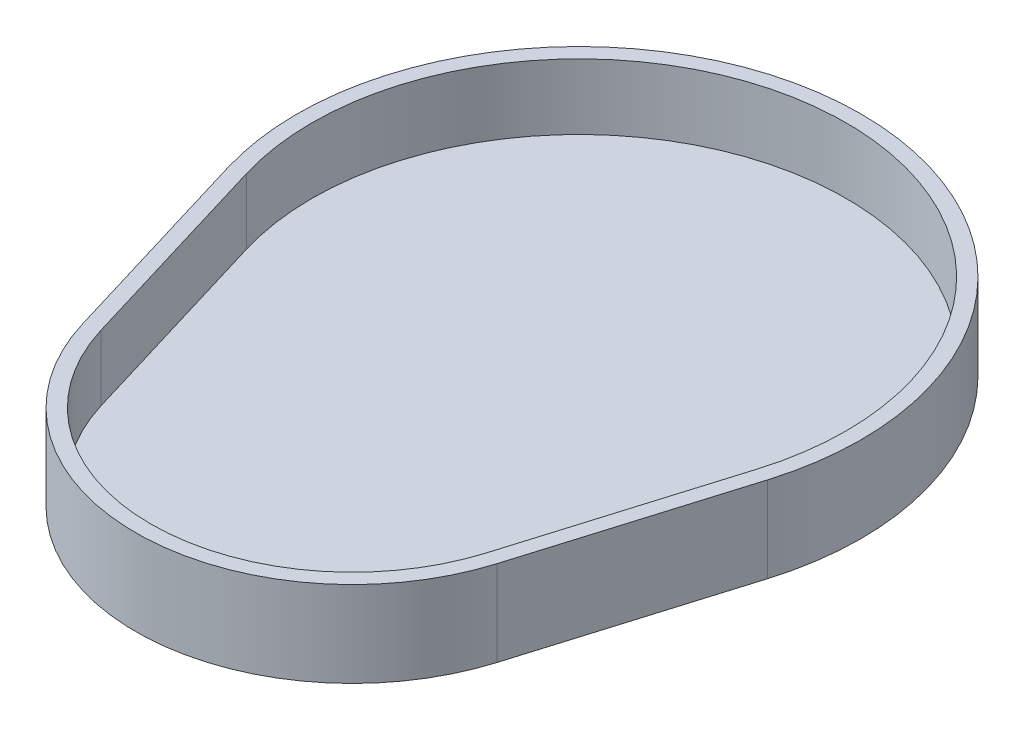
ISO-10303-21;
HEADER;
FILE_DESCRIPTION(('STEP AP214'),'2;1');
FILE_NAME('part.step','',(''),(''),'','','');
FILE_SCHEMA(('AUTOMOTIVE_DESIGN { 1 0 10303 214 1 1 1 1 }'));
ENDSEC;
DATA;
#1=APPLICATION_CONTEXT('core data for automotive mechanical design processes');
#2=APPLICATION_PROTOCOL_DEFINITION('international standard','automotive_design',2000,#1);
#3=PRODUCT_CONTEXT('',#1,'mechanical');
#4=PRODUCT('Part','Part','',(#3));
#5=PRODUCT_RELATED_PRODUCT_CATEGORY('part','',(#4));
#6=PRODUCT_DEFINITION_FORMATION('','',#4);
#7=PRODUCT_DEFINITION_CONTEXT('part definition',#1,'design');
#8=PRODUCT_DEFINITION('design','',#6,#7);
#9=PRODUCT_DEFINITION_SHAPE('','',#8);
#10=(LENGTH_UNIT() NAMED_UNIT(*) SI_UNIT(.MILLI.,.METRE.));
#11=(NAMED_UNIT(*) PLANE_ANGLE_UNIT() SI_UNIT($,.RADIAN.));
#12=(NAMED_UNIT(*) SI_UNIT($,.STERADIAN.) SOLID_ANGLE_UNIT());
#13=UNCERTAINTY_MEASURE_WITH_UNIT(LENGTH_MEASURE(1.E-05),#10,'distance_accuracy_value','');
#14=(GEOMETRIC_REPRESENTATION_CONTEXT(3) GLOBAL_UNCERTAINTY_ASSIGNED_CONTEXT((#13)) GLOBAL_UNIT_ASSIGNED_CONTEXT((#10,
#11,#12)) REPRESENTATION_CONTEXT('',''));
#15=CARTESIAN_POINT('',(0.,0.,0.));
#16=DIRECTION('',(0.,0.,1.));
#17=DIRECTION('',(1.,0.,0.));
#18=AXIS2_PLACEMENT_3D('',#15,#16,#17);
#19=CARTESIAN_POINT('',(0.,4.,31.));
#20=DIRECTION('',(0.,-1.,0.));
#21=DIRECTION('',(0.,0.,-1.));
#22=AXIS2_PLACEMENT_3D('',#19,#20,#21);
#23=CYLINDRICAL_SURFACE('',#22,43.);
#24=CARTESIAN_POINT('',(0.,0.,31.));
#25=DIRECTION('',(0.,1.,0.));
#26=DIRECTION('',(0.,0.,1.));
#27=AXIS2_PLACEMENT_3D('',#24,#25,#26);
#28=CIRCLE('',#27,43.);
#29=CARTESIAN_POINT('',(-41.1665931923171,0.,43.4222222222222));
#30=VERTEX_POINT('',#29);
#31=CARTESIAN_POINT('',(41.1665931923171,0.,43.4222222222222));
#32=VERTEX_POINT('',#31);
#33=EDGE_CURVE('E150',#30,#32,#28,.T.);
#34=ORIENTED_EDGE('',*,*,#33,.T.);
#35=DIRECTION('',(0.,-1.,0.));
#36=VECTOR('',#35,1.);
#37=CARTESIAN_POINT('',(41.1665931923171,4.,43.4222222222222));
#38=LINE('',#37,#36);
#39=CARTESIAN_POINT('',(41.1665931923171,17.,43.4222222222222));
#40=VERTEX_POINT('',#39);
#41=EDGE_CURVE('E11',#40,#32,#38,.T.);
#42=ORIENTED_EDGE('',*,*,#41,.F.);
#43=CARTESIAN_POINT('',(0.,17.,31.));
#44=DIRECTION('',(0.,1.,0.));
#45=DIRECTION('',(0.,0.,1.));
#46=AXIS2_PLACEMENT_3D('',#43,#44,#45);
#47=CIRCLE('',#46,43.);
#48=CARTESIAN_POINT('',(-41.1665931923171,17.,43.4222222222222));
#49=VERTEX_POINT('',#48);
#50=EDGE_CURVE('E117',#49,#40,#47,.T.);
#51=ORIENTED_EDGE('',*,*,#50,.F.);
#52=DIRECTION('',(0.,-1.,0.));
#53=VECTOR('',#52,1.);
#54=CARTESIAN_POINT('',(-41.1665931923171,4.,43.4222222222222));
#55=LINE('',#54,#53);
#56=EDGE_CURVE('E159',#49,#30,#55,.T.);
#57=ORIENTED_EDGE('',*,*,#56,.T.);
#58=EDGE_LOOP('',(#34,#42,#51,#57));
#59=FACE_BOUND('',#58,.T.);
#60=ADVANCED_FACE('F39',(#59),#23,.T.);
#61=CARTESIAN_POINT('',(41.1665931923171,4.,43.4222222222222));
#62=DIRECTION('',(-0.957362632379468,0.,-0.288888888888889));
#63=DIRECTION('',(-0.288888888888889,0.,0.957362632379468));
#64=AXIS2_PLACEMENT_3D('',#61,#62,#63);
#65=PLANE('',#64);
#66=DIRECTION('',(0.288888888888888,0.,-0.957362632379467));
#67=VECTOR('',#66,1.);
#68=CARTESIAN_POINT('',(41.1665931923171,0.,43.4222222222222));
#69=LINE('',#68,#67);
#70=CARTESIAN_POINT('',(53.6123074132502,0.,2.17777777777777));
#71=VERTEX_POINT('',#70);
#72=EDGE_CURVE('E153',#32,#71,#69,.T.);
#73=ORIENTED_EDGE('',*,*,#72,.T.);
#74=DIRECTION('',(0.,-1.,0.));
#75=VECTOR('',#74,1.);
#76=CARTESIAN_POINT('',(53.6123074132502,4.,2.17777777777777));
#77=LINE('',#76,#75);
#78=CARTESIAN_POINT('',(53.6123074132502,17.,2.17777777777777));
#79=VERTEX_POINT('',#78);
#80=EDGE_CURVE('E46',#79,#71,#77,.T.);
#81=ORIENTED_EDGE('',*,*,#80,.F.);
#82=DIRECTION('',(0.288888888888888,0.,-0.957362632379467));
#83=VECTOR('',#82,1.);
#84=CARTESIAN_POINT('',(41.1665931923171,17.,43.4222222222222));
#85=LINE('',#84,#83);
#86=EDGE_CURVE('E141',#40,#79,#85,.T.);
#87=ORIENTED_EDGE('',*,*,#86,.F.);
#88=ORIENTED_EDGE('',*,*,#41,.T.);
#89=EDGE_LOOP('',(#73,#81,#87,#88));
#90=FACE_BOUND('',#89,.T.);
#91=ADVANCED_FACE('F181',(#90),#65,.F.);
#92=CARTESIAN_POINT('',(0.,4.,-14.));
#93=DIRECTION('',(0.,-1.,0.));
#94=DIRECTION('',(0.,0.,-1.));
#95=AXIS2_PLACEMENT_3D('',#92,#93,#94);
#96=CYLINDRICAL_SURFACE('',#95,56.);
#97=CARTESIAN_POINT('',(0.,0.,-14.));
#98=DIRECTION('',(0.,1.,0.));
#99=DIRECTION('',(0.,0.,1.));
#100=AXIS2_PLACEMENT_3D('',#97,#98,#99);
#101=CIRCLE('',#100,56.);
#102=CARTESIAN_POINT('',(-53.6123074132502,0.,2.17777777777778));
#103=VERTEX_POINT('',#102);
#104=EDGE_CURVE('E155',#71,#103,#101,.T.);
#105=ORIENTED_EDGE('',*,*,#104,.T.);
#106=DIRECTION('',(0.,-1.,0.));
#107=VECTOR('',#106,1.);
#108=CARTESIAN_POINT('',(-53.6123074132502,4.,2.17777777777778));
#109=LINE('',#108,#107);
#110=CARTESIAN_POINT('',(-53.6123074132502,17.,2.17777777777776));
#111=VERTEX_POINT('',#110);
#112=EDGE_CURVE('E162',#111,#103,#109,.T.);
#113=ORIENTED_EDGE('',*,*,#112,.F.);
#114=CARTESIAN_POINT('',(0.,17.,-14.));
#115=DIRECTION('',(0.,1.,0.));
#116=DIRECTION('',(0.,0.,1.));
#117=AXIS2_PLACEMENT_3D('',#114,#115,#116);
#118=CIRCLE('',#117,56.);
#119=EDGE_CURVE('E144',#79,#111,#118,.T.);
#120=ORIENTED_EDGE('',*,*,#119,.F.);
#121=ORIENTED_EDGE('',*,*,#80,.T.);
#122=EDGE_LOOP('',(#105,#113,#120,#121));
#123=FACE_BOUND('',#122,.T.);
#124=ADVANCED_FACE('F168',(#123),#96,.T.);
#125=CARTESIAN_POINT('',(-53.6123074132502,4.,2.17777777777778));
#126=DIRECTION('',(0.957362632379468,0.,-0.288888888888889));
#127=DIRECTION('',(-0.288888888888889,0.,-0.957362632379468));
#128=AXIS2_PLACEMENT_3D('',#125,#126,#127);
#129=PLANE('',#128);
#130=DIRECTION('',(0.288888888888889,0.,0.957362632379467));
#131=VECTOR('',#130,1.);
#132=CARTESIAN_POINT('',(-53.6123074132502,0.,2.17777777777778));
#133=LINE('',#132,#131);
#134=EDGE_CURVE('E157',#103,#30,#133,.T.);
#135=ORIENTED_EDGE('',*,*,#134,.T.);
#136=ORIENTED_EDGE('',*,*,#56,.F.);
#137=DIRECTION('',(0.288888888888889,0.,0.957362632379467));
#138=VECTOR('',#137,1.);
#139=CARTESIAN_POINT('',(-53.6123074132502,17.,2.17777777777778));
#140=LINE('',#139,#138);
#141=EDGE_CURVE('E147',#111,#49,#140,.T.);
#142=ORIENTED_EDGE('',*,*,#141,.F.);
#143=ORIENTED_EDGE('',*,*,#112,.T.);
#144=EDGE_LOOP('',(#135,#136,#142,#143));
#145=FACE_BOUND('',#144,.T.);
#146=ADVANCED_FACE('F176',(#145),#129,.F.);
#147=CARTESIAN_POINT('',(0.,0.,31.));
#148=DIRECTION('',(0.,1.,0.));
#149=DIRECTION('',(0.,0.,1.));
#150=AXIS2_PLACEMENT_3D('',#147,#148,#149);
#151=PLANE('',#150);
#152=ORIENTED_EDGE('',*,*,#33,.F.);
#153=ORIENTED_EDGE('',*,*,#134,.F.);
#154=ORIENTED_EDGE('',*,*,#104,.F.);
#155=ORIENTED_EDGE('',*,*,#72,.F.);
#156=EDGE_LOOP('',(#152,#153,#154,#155));
#157=FACE_BOUND('',#156,.T.);
#158=ADVANCED_FACE('F174',(#157),#151,.F.);
#159=CARTESIAN_POINT('',(0.,17.,31.));
#160=DIRECTION('',(0.,1.,0.));
#161=DIRECTION('',(0.,0.,1.));
#162=AXIS2_PLACEMENT_3D('',#159,#160,#161);
#163=PLANE('',#162);
#164=ORIENTED_EDGE('',*,*,#50,.T.);
#165=ORIENTED_EDGE('',*,*,#86,.T.);
#166=ORIENTED_EDGE('',*,*,#119,.T.);
#167=ORIENTED_EDGE('',*,*,#141,.T.);
#168=EDGE_LOOP('',(#164,#165,#166,#167));
#169=FACE_BOUND('',#168,.T.);
#170=DIRECTION('',(0.288888888888888,0.,-0.957362632379468));
#171=VECTOR('',#170,1.);
#172=CARTESIAN_POINT('',(38.2945052951787,17.,42.5555555555556));
#173=LINE('',#172,#171);
#174=CARTESIAN_POINT('',(38.2945052951787,17.,42.5555555555556));
#175=VERTEX_POINT('',#174);
#176=CARTESIAN_POINT('',(50.7402195161118,17.,1.3111111111111));
#177=VERTEX_POINT('',#176);
#178=EDGE_CURVE('E111',#175,#177,#173,.T.);
#179=ORIENTED_EDGE('',*,*,#178,.F.);
#180=CARTESIAN_POINT('',(0.,17.,31.));
#181=DIRECTION('',(0.,1.,0.));
#182=DIRECTION('',(0.,0.,1.));
#183=AXIS2_PLACEMENT_3D('',#180,#181,#182);
#184=CIRCLE('',#183,40.);
#185=CARTESIAN_POINT('',(-38.2945052951787,17.,42.5555555555556));
#186=VERTEX_POINT('',#185);
#187=EDGE_CURVE('E102',#186,#175,#184,.T.);
#188=ORIENTED_EDGE('',*,*,#187,.F.);
#189=DIRECTION('',(0.288888888888889,0.,0.957362632379468));
#190=VECTOR('',#189,1.);
#191=CARTESIAN_POINT('',(-50.7402195161118,17.,1.31111111111108));
#192=LINE('',#191,#190);
#193=CARTESIAN_POINT('',(-50.7402195161118,17.,1.3111111111111));
#194=VERTEX_POINT('',#193);
#195=EDGE_CURVE('E125',#194,#186,#192,.T.);
#196=ORIENTED_EDGE('',*,*,#195,.F.);
#197=CARTESIAN_POINT('',(0.,17.,-14.));
#198=DIRECTION('',(0.,1.,0.));
#199=DIRECTION('',(0.,0.,1.));
#200=AXIS2_PLACEMENT_3D('',#197,#198,#199);
#201=CIRCLE('',#200,53.);
#202=EDGE_CURVE('E123',#177,#194,#201,.T.);
#203=ORIENTED_EDGE('',*,*,#202,.F.);
#204=EDGE_LOOP('',(#179,#188,#196,#203));
#205=FACE_BOUND('',#204,.T.);
#206=ADVANCED_FACE('F121',(#169,#205),#163,.T.);
#207=CARTESIAN_POINT('',(0.,17.,31.));
#208=DIRECTION('',(0.,-1.,0.));
#209=DIRECTION('',(0.,0.,-1.));
#210=AXIS2_PLACEMENT_3D('',#207,#208,#209);
#211=CYLINDRICAL_SURFACE('',#210,40.);
#212=CARTESIAN_POINT('',(0.,4.,31.));
#213=DIRECTION('',(0.,1.,0.));
#214=DIRECTION('',(0.,0.,1.));
#215=AXIS2_PLACEMENT_3D('',#212,#213,#214);
#216=CIRCLE('',#215,40.);
#217=CARTESIAN_POINT('',(-38.2945052951787,4.,42.5555555555556));
#218=VERTEX_POINT('',#217);
#219=CARTESIAN_POINT('',(38.2945052951787,4.,42.5555555555556));
#220=VERTEX_POINT('',#219);
#221=EDGE_CURVE('E53',#218,#220,#216,.T.);
#222=ORIENTED_EDGE('',*,*,#221,.F.);
#223=DIRECTION('',(0.,-1.,0.));
#224=VECTOR('',#223,1.);
#225=CARTESIAN_POINT('',(-38.2945052951787,17.,42.5555555555556));
#226=LINE('',#225,#224);
#227=EDGE_CURVE('E107',#186,#218,#226,.T.);
#228=ORIENTED_EDGE('',*,*,#227,.F.);
#229=ORIENTED_EDGE('',*,*,#187,.T.);
#230=DIRECTION('',(0.,-1.,0.));
#231=VECTOR('',#230,1.);
#232=CARTESIAN_POINT('',(38.2945052951787,17.,42.5555555555556));
#233=LINE('',#232,#231);
#234=EDGE_CURVE('E105',#175,#220,#233,.T.);
#235=ORIENTED_EDGE('',*,*,#234,.T.);
#236=EDGE_LOOP('',(#222,#228,#229,#235));
#237=FACE_BOUND('',#236,.T.);
#238=ADVANCED_FACE('F104',(#237),#211,.F.);
#239=CARTESIAN_POINT('',(38.2945052951787,17.,42.5555555555556));
#240=DIRECTION('',(-0.957362632379468,0.,-0.288888888888888));
#241=DIRECTION('',(-0.288888888888888,0.,0.957362632379468));
#242=AXIS2_PLACEMENT_3D('',#239,#240,#241);
#243=PLANE('',#242);
#244=DIRECTION('',(0.288888888888888,0.,-0.957362632379468));
#245=VECTOR('',#244,1.);
#246=CARTESIAN_POINT('',(38.2945052951787,4.,42.5555555555556));
#247=LINE('',#246,#245);
#248=CARTESIAN_POINT('',(50.7402195161118,4.,1.3111111111111));
#249=VERTEX_POINT('',#248);
#250=EDGE_CURVE('E57',#220,#249,#247,.T.);
#251=ORIENTED_EDGE('',*,*,#250,.F.);
#252=ORIENTED_EDGE('',*,*,#234,.F.);
#253=ORIENTED_EDGE('',*,*,#178,.T.);
#254=DIRECTION('',(0.,-1.,0.));
#255=VECTOR('',#254,1.);
#256=CARTESIAN_POINT('',(50.7402195161118,17.,1.3111111111111));
#257=LINE('',#256,#255);
#258=EDGE_CURVE('E118',#177,#249,#257,.T.);
#259=ORIENTED_EDGE('',*,*,#258,.T.);
#260=EDGE_LOOP('',(#251,#252,#253,#259));
#261=FACE_BOUND('',#260,.T.);
#262=ADVANCED_FACE('F115',(#261),#243,.T.);
#263=CARTESIAN_POINT('',(0.,17.,-14.));
#264=DIRECTION('',(0.,-1.,0.));
#265=DIRECTION('',(0.,0.,-1.));
#266=AXIS2_PLACEMENT_3D('',#263,#264,#265);
#267=CYLINDRICAL_SURFACE('',#266,53.);
#268=CARTESIAN_POINT('',(0.,4.,-14.));
#269=DIRECTION('',(0.,1.,0.));
#270=DIRECTION('',(0.,0.,1.));
#271=AXIS2_PLACEMENT_3D('',#268,#269,#270);
#272=CIRCLE('',#271,53.);
#273=CARTESIAN_POINT('',(-50.7402195161118,4.,1.31111111111109));
#274=VERTEX_POINT('',#273);
#275=EDGE_CURVE('E131',#249,#274,#272,.T.);
#276=ORIENTED_EDGE('',*,*,#275,.F.);
#277=ORIENTED_EDGE('',*,*,#258,.F.);
#278=ORIENTED_EDGE('',*,*,#202,.T.);
#279=DIRECTION('',(0.,-1.,0.));
#280=VECTOR('',#279,1.);
#281=CARTESIAN_POINT('',(-50.7402195161118,17.,1.31111111111109));
#282=LINE('',#281,#280);
#283=EDGE_CURVE('E135',#194,#274,#282,.T.);
#284=ORIENTED_EDGE('',*,*,#283,.T.);
#285=EDGE_LOOP('',(#276,#277,#278,#284));
#286=FACE_BOUND('',#285,.T.);
#287=ADVANCED_FACE('F203',(#286),#267,.F.);
#288=CARTESIAN_POINT('',(-50.7402195161118,17.,1.31111111111108));
#289=DIRECTION('',(0.957362632379468,0.,-0.288888888888889));
#290=DIRECTION('',(-0.288888888888889,0.,-0.957362632379468));
#291=AXIS2_PLACEMENT_3D('',#288,#289,#290);
#292=PLANE('',#291);
#293=DIRECTION('',(0.288888888888889,0.,0.957362632379468));
#294=VECTOR('',#293,1.);
#295=CARTESIAN_POINT('',(-50.7402195161118,4.,1.31111111111108));
#296=LINE('',#295,#294);
#297=EDGE_CURVE('E112',#274,#218,#296,.T.);
#298=ORIENTED_EDGE('',*,*,#297,.F.);
#299=ORIENTED_EDGE('',*,*,#283,.F.);
#300=ORIENTED_EDGE('',*,*,#195,.T.);
#301=ORIENTED_EDGE('',*,*,#227,.T.);
#302=EDGE_LOOP('',(#298,#299,#300,#301));
#303=FACE_BOUND('',#302,.T.);
#304=ADVANCED_FACE('F196',(#303),#292,.T.);
#305=CARTESIAN_POINT('',(0.,4.,31.));
#306=DIRECTION('',(0.,1.,0.));
#307=DIRECTION('',(0.,0.,1.));
#308=AXIS2_PLACEMENT_3D('',#305,#306,#307);
#309=PLANE('',#308);
#310=ORIENTED_EDGE('',*,*,#221,.T.);
#311=ORIENTED_EDGE('',*,*,#250,.T.);
#312=ORIENTED_EDGE('',*,*,#275,.T.);
#313=ORIENTED_EDGE('',*,*,#297,.T.);
#314=EDGE_LOOP('',(#310,#311,#312,#313));
#315=FACE_BOUND('',#314,.T.);
#316=ADVANCED_FACE('F193',(#315),#309,.T.);
#317=CLOSED_SHELL('',(#60,#91,#124,#146,#158,#206,#238,#262,#287,#304,#316));
#318=MANIFOLD_SOLID_BREP('B2',#317);
#319=ADVANCED_BREP_SHAPE_REPRESENTATION('',(#18,#318),#14);
#320=SHAPE_DEFINITION_REPRESENTATION(#9,#319);
ENDSEC;
END-ISO-10303-21;
